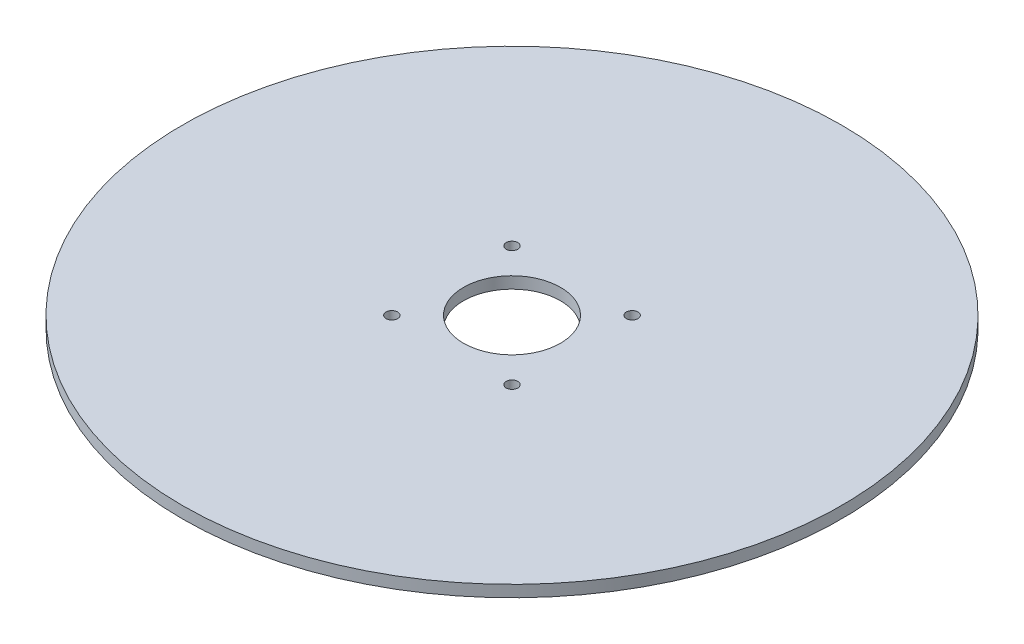
ISO-10303-21;
HEADER;
FILE_DESCRIPTION(('STEP AP214'),'2;1');
FILE_NAME('part.step','',(''),(''),'','','');
FILE_SCHEMA(('AUTOMOTIVE_DESIGN { 1 0 10303 214 1 1 1 1 }'));
ENDSEC;
DATA;
#1=APPLICATION_CONTEXT('core data for automotive mechanical design processes');
#2=APPLICATION_PROTOCOL_DEFINITION('international standard','automotive_design',2000,#1);
#3=PRODUCT_CONTEXT('',#1,'mechanical');
#4=PRODUCT('Part','Part','',(#3));
#5=PRODUCT_RELATED_PRODUCT_CATEGORY('part','',(#4));
#6=PRODUCT_DEFINITION_FORMATION('','',#4);
#7=PRODUCT_DEFINITION_CONTEXT('part definition',#1,'design');
#8=PRODUCT_DEFINITION('design','',#6,#7);
#9=PRODUCT_DEFINITION_SHAPE('','',#8);
#10=(LENGTH_UNIT() NAMED_UNIT(*) SI_UNIT(.MILLI.,.METRE.));
#11=(NAMED_UNIT(*) PLANE_ANGLE_UNIT() SI_UNIT($,.RADIAN.));
#12=(NAMED_UNIT(*) SI_UNIT($,.STERADIAN.) SOLID_ANGLE_UNIT());
#13=UNCERTAINTY_MEASURE_WITH_UNIT(LENGTH_MEASURE(1.E-05),#10,'distance_accuracy_value','');
#14=(GEOMETRIC_REPRESENTATION_CONTEXT(3) GLOBAL_UNCERTAINTY_ASSIGNED_CONTEXT((#13)) GLOBAL_UNIT_ASSIGNED_CONTEXT((#10,
#11,#12)) REPRESENTATION_CONTEXT('',''));
#15=CARTESIAN_POINT('',(0.,0.,0.));
#16=DIRECTION('',(0.,0.,1.));
#17=DIRECTION('',(1.,0.,0.));
#18=AXIS2_PLACEMENT_3D('',#15,#16,#17);
#19=CARTESIAN_POINT('',(0.,3.,0.));
#20=DIRECTION('',(0.,1.,0.));
#21=DIRECTION('',(0.,0.,1.));
#22=AXIS2_PLACEMENT_3D('',#19,#20,#21);
#23=PLANE('',#22);
#24=CARTESIAN_POINT('',(-15.5,3.,15.5));
#25=DIRECTION('',(0.,1.,0.));
#26=DIRECTION('',(0.,0.,1.));
#27=AXIS2_PLACEMENT_3D('',#24,#25,#26);
#28=CIRCLE('',#27,1.5);
#29=CARTESIAN_POINT('',(-15.5,3.,17.));
#30=VERTEX_POINT('',#29);
#31=EDGE_CURVE('E87',#30,#30,#28,.T.);
#32=ORIENTED_EDGE('',*,*,#31,.F.);
#33=EDGE_LOOP('',(#32));
#34=FACE_BOUND('',#33,.T.);
#35=CARTESIAN_POINT('',(15.5,3.,15.5));
#36=DIRECTION('',(0.,1.,0.));
#37=DIRECTION('',(0.,0.,1.));
#38=AXIS2_PLACEMENT_3D('',#35,#36,#37);
#39=CIRCLE('',#38,1.5);
#40=CARTESIAN_POINT('',(15.5,3.,17.));
#41=VERTEX_POINT('',#40);
#42=EDGE_CURVE('E91',#41,#41,#39,.T.);
#43=ORIENTED_EDGE('',*,*,#42,.F.);
#44=EDGE_LOOP('',(#43));
#45=FACE_BOUND('',#44,.T.);
#46=CARTESIAN_POINT('',(15.5,3.,-15.5));
#47=DIRECTION('',(0.,1.,0.));
#48=DIRECTION('',(0.,0.,1.));
#49=AXIS2_PLACEMENT_3D('',#46,#47,#48);
#50=CIRCLE('',#49,1.5);
#51=CARTESIAN_POINT('',(15.5,3.,-14.));
#52=VERTEX_POINT('',#51);
#53=EDGE_CURVE('E86',#52,#52,#50,.T.);
#54=ORIENTED_EDGE('',*,*,#53,.F.);
#55=EDGE_LOOP('',(#54));
#56=FACE_BOUND('',#55,.T.);
#57=CARTESIAN_POINT('',(-15.5,3.,-15.5));
#58=DIRECTION('',(0.,1.,0.));
#59=DIRECTION('',(0.,0.,1.));
#60=AXIS2_PLACEMENT_3D('',#57,#58,#59);
#61=CIRCLE('',#60,1.5);
#62=CARTESIAN_POINT('',(-15.5,3.,-14.));
#63=VERTEX_POINT('',#62);
#64=EDGE_CURVE('E62',#63,#63,#61,.T.);
#65=ORIENTED_EDGE('',*,*,#64,.F.);
#66=EDGE_LOOP('',(#65));
#67=FACE_BOUND('',#66,.T.);
#68=CARTESIAN_POINT('',(0.,3.,0.));
#69=DIRECTION('',(0.,1.,0.));
#70=DIRECTION('',(0.,0.,1.));
#71=AXIS2_PLACEMENT_3D('',#68,#69,#70);
#72=CIRCLE('',#71,85.);
#73=CARTESIAN_POINT('',(0.,3.,85.));
#74=VERTEX_POINT('',#73);
#75=EDGE_CURVE('E10',#74,#74,#72,.T.);
#76=ORIENTED_EDGE('',*,*,#75,.T.);
#77=EDGE_LOOP('',(#76));
#78=FACE_BOUND('',#77,.T.);
#79=CARTESIAN_POINT('',(0.,3.,0.));
#80=DIRECTION('',(0.,1.,0.));
#81=DIRECTION('',(0.,0.,1.));
#82=AXIS2_PLACEMENT_3D('',#79,#80,#81);
#83=CIRCLE('',#82,12.5);
#84=CARTESIAN_POINT('',(0.,3.,12.5));
#85=VERTEX_POINT('',#84);
#86=EDGE_CURVE('E51',#85,#85,#83,.T.);
#87=ORIENTED_EDGE('',*,*,#86,.F.);
#88=EDGE_LOOP('',(#87));
#89=FACE_BOUND('',#88,.T.);
#90=ADVANCED_FACE('F36',(#34,#45,#56,#67,#78,#89),#23,.T.);
#91=CARTESIAN_POINT('',(0.,0.,0.));
#92=DIRECTION('',(0.,1.,0.));
#93=DIRECTION('',(0.,0.,1.));
#94=AXIS2_PLACEMENT_3D('',#91,#92,#93);
#95=PLANE('',#94);
#96=CARTESIAN_POINT('',(-15.5,0.,15.5));
#97=DIRECTION('',(0.,1.,0.));
#98=DIRECTION('',(0.,0.,1.));
#99=AXIS2_PLACEMENT_3D('',#96,#97,#98);
#100=CIRCLE('',#99,1.5);
#101=CARTESIAN_POINT('',(-15.5,0.,17.));
#102=VERTEX_POINT('',#101);
#103=EDGE_CURVE('E40',#102,#102,#100,.T.);
#104=ORIENTED_EDGE('',*,*,#103,.T.);
#105=EDGE_LOOP('',(#104));
#106=FACE_BOUND('',#105,.T.);
#107=CARTESIAN_POINT('',(15.5,0.,15.5));
#108=DIRECTION('',(0.,1.,0.));
#109=DIRECTION('',(0.,0.,1.));
#110=AXIS2_PLACEMENT_3D('',#107,#108,#109);
#111=CIRCLE('',#110,1.5);
#112=CARTESIAN_POINT('',(15.5,0.,17.));
#113=VERTEX_POINT('',#112);
#114=EDGE_CURVE('E65',#113,#113,#111,.T.);
#115=ORIENTED_EDGE('',*,*,#114,.T.);
#116=EDGE_LOOP('',(#115));
#117=FACE_BOUND('',#116,.T.);
#118=CARTESIAN_POINT('',(15.5,0.,-15.5));
#119=DIRECTION('',(0.,1.,0.));
#120=DIRECTION('',(0.,0.,1.));
#121=AXIS2_PLACEMENT_3D('',#118,#119,#120);
#122=CIRCLE('',#121,1.5);
#123=CARTESIAN_POINT('',(15.5,0.,-14.));
#124=VERTEX_POINT('',#123);
#125=EDGE_CURVE('E61',#124,#124,#122,.T.);
#126=ORIENTED_EDGE('',*,*,#125,.T.);
#127=EDGE_LOOP('',(#126));
#128=FACE_BOUND('',#127,.T.);
#129=CARTESIAN_POINT('',(-15.5,0.,-15.5));
#130=DIRECTION('',(0.,1.,0.));
#131=DIRECTION('',(0.,0.,1.));
#132=AXIS2_PLACEMENT_3D('',#129,#130,#131);
#133=CIRCLE('',#132,1.5);
#134=CARTESIAN_POINT('',(-15.5,0.,-14.));
#135=VERTEX_POINT('',#134);
#136=EDGE_CURVE('E57',#135,#135,#133,.T.);
#137=ORIENTED_EDGE('',*,*,#136,.T.);
#138=EDGE_LOOP('',(#137));
#139=FACE_BOUND('',#138,.T.);
#140=CARTESIAN_POINT('',(0.,0.,0.));
#141=DIRECTION('',(0.,1.,0.));
#142=DIRECTION('',(0.,0.,1.));
#143=AXIS2_PLACEMENT_3D('',#140,#141,#142);
#144=CIRCLE('',#143,85.);
#145=CARTESIAN_POINT('',(0.,0.,85.));
#146=VERTEX_POINT('',#145);
#147=EDGE_CURVE('E45',#146,#146,#144,.T.);
#148=ORIENTED_EDGE('',*,*,#147,.F.);
#149=EDGE_LOOP('',(#148));
#150=FACE_BOUND('',#149,.T.);
#151=CARTESIAN_POINT('',(0.,0.,0.));
#152=DIRECTION('',(0.,1.,0.));
#153=DIRECTION('',(0.,0.,1.));
#154=AXIS2_PLACEMENT_3D('',#151,#152,#153);
#155=CIRCLE('',#154,12.5);
#156=CARTESIAN_POINT('',(0.,0.,12.5));
#157=VERTEX_POINT('',#156);
#158=EDGE_CURVE('E54',#157,#157,#155,.T.);
#159=ORIENTED_EDGE('',*,*,#158,.T.);
#160=EDGE_LOOP('',(#159));
#161=FACE_BOUND('',#160,.T.);
#162=ADVANCED_FACE('F104',(#106,#117,#128,#139,#150,#161),#95,.F.);
#163=CARTESIAN_POINT('',(0.,3.,0.));
#164=DIRECTION('',(0.,-1.,0.));
#165=DIRECTION('',(0.,0.,-1.));
#166=AXIS2_PLACEMENT_3D('',#163,#164,#165);
#167=CYLINDRICAL_SURFACE('',#166,85.);
#168=ORIENTED_EDGE('',*,*,#75,.F.);
#169=EDGE_LOOP('',(#168));
#170=FACE_BOUND('',#169,.T.);
#171=ORIENTED_EDGE('',*,*,#147,.T.);
#172=EDGE_LOOP('',(#171));
#173=FACE_BOUND('',#172,.T.);
#174=ADVANCED_FACE('F38',(#170,#173),#167,.T.);
#175=CARTESIAN_POINT('',(0.,3.,0.));
#176=DIRECTION('',(0.,-1.,0.));
#177=DIRECTION('',(0.,0.,-1.));
#178=AXIS2_PLACEMENT_3D('',#175,#176,#177);
#179=CYLINDRICAL_SURFACE('',#178,12.5);
#180=ORIENTED_EDGE('',*,*,#86,.T.);
#181=EDGE_LOOP('',(#180));
#182=FACE_BOUND('',#181,.T.);
#183=ORIENTED_EDGE('',*,*,#158,.F.);
#184=EDGE_LOOP('',(#183));
#185=FACE_BOUND('',#184,.T.);
#186=ADVANCED_FACE('F113',(#182,#185),#179,.F.);
#187=CARTESIAN_POINT('',(-15.5,-7.,-15.5));
#188=DIRECTION('',(0.,1.,0.));
#189=DIRECTION('',(0.,0.,1.));
#190=AXIS2_PLACEMENT_3D('',#187,#188,#189);
#191=CYLINDRICAL_SURFACE('',#190,1.5);
#192=ORIENTED_EDGE('',*,*,#64,.T.);
#193=EDGE_LOOP('',(#192));
#194=FACE_BOUND('',#193,.T.);
#195=ORIENTED_EDGE('',*,*,#136,.F.);
#196=EDGE_LOOP('',(#195));
#197=FACE_BOUND('',#196,.T.);
#198=ADVANCED_FACE('F110',(#194,#197),#191,.F.);
#199=CARTESIAN_POINT('',(15.5,-7.,-15.5));
#200=DIRECTION('',(0.,1.,0.));
#201=DIRECTION('',(0.,0.,1.));
#202=AXIS2_PLACEMENT_3D('',#199,#200,#201);
#203=CYLINDRICAL_SURFACE('',#202,1.5);
#204=ORIENTED_EDGE('',*,*,#53,.T.);
#205=EDGE_LOOP('',(#204));
#206=FACE_BOUND('',#205,.T.);
#207=ORIENTED_EDGE('',*,*,#125,.F.);
#208=EDGE_LOOP('',(#207));
#209=FACE_BOUND('',#208,.T.);
#210=ADVANCED_FACE('F99',(#206,#209),#203,.F.);
#211=CARTESIAN_POINT('',(15.5,-7.,15.5));
#212=DIRECTION('',(0.,1.,0.));
#213=DIRECTION('',(0.,0.,1.));
#214=AXIS2_PLACEMENT_3D('',#211,#212,#213);
#215=CYLINDRICAL_SURFACE('',#214,1.5);
#216=ORIENTED_EDGE('',*,*,#42,.T.);
#217=EDGE_LOOP('',(#216));
#218=FACE_BOUND('',#217,.T.);
#219=ORIENTED_EDGE('',*,*,#114,.F.);
#220=EDGE_LOOP('',(#219));
#221=FACE_BOUND('',#220,.T.);
#222=ADVANCED_FACE('F135',(#218,#221),#215,.F.);
#223=CARTESIAN_POINT('',(-15.5,-7.,15.5));
#224=DIRECTION('',(0.,1.,0.));
#225=DIRECTION('',(0.,0.,1.));
#226=AXIS2_PLACEMENT_3D('',#223,#224,#225);
#227=CYLINDRICAL_SURFACE('',#226,1.5);
#228=ORIENTED_EDGE('',*,*,#31,.T.);
#229=EDGE_LOOP('',(#228));
#230=FACE_BOUND('',#229,.T.);
#231=ORIENTED_EDGE('',*,*,#103,.F.);
#232=EDGE_LOOP('',(#231));
#233=FACE_BOUND('',#232,.T.);
#234=ADVANCED_FACE('F132',(#230,#233),#227,.F.);
#235=CLOSED_SHELL('',(#90,#162,#174,#186,#198,#210,#222,#234));
#236=MANIFOLD_SOLID_BREP('B2',#235);
#237=ADVANCED_BREP_SHAPE_REPRESENTATION('',(#18,#236),#14);
#238=SHAPE_DEFINITION_REPRESENTATION(#9,#237);
ENDSEC;
END-ISO-10303-21;
